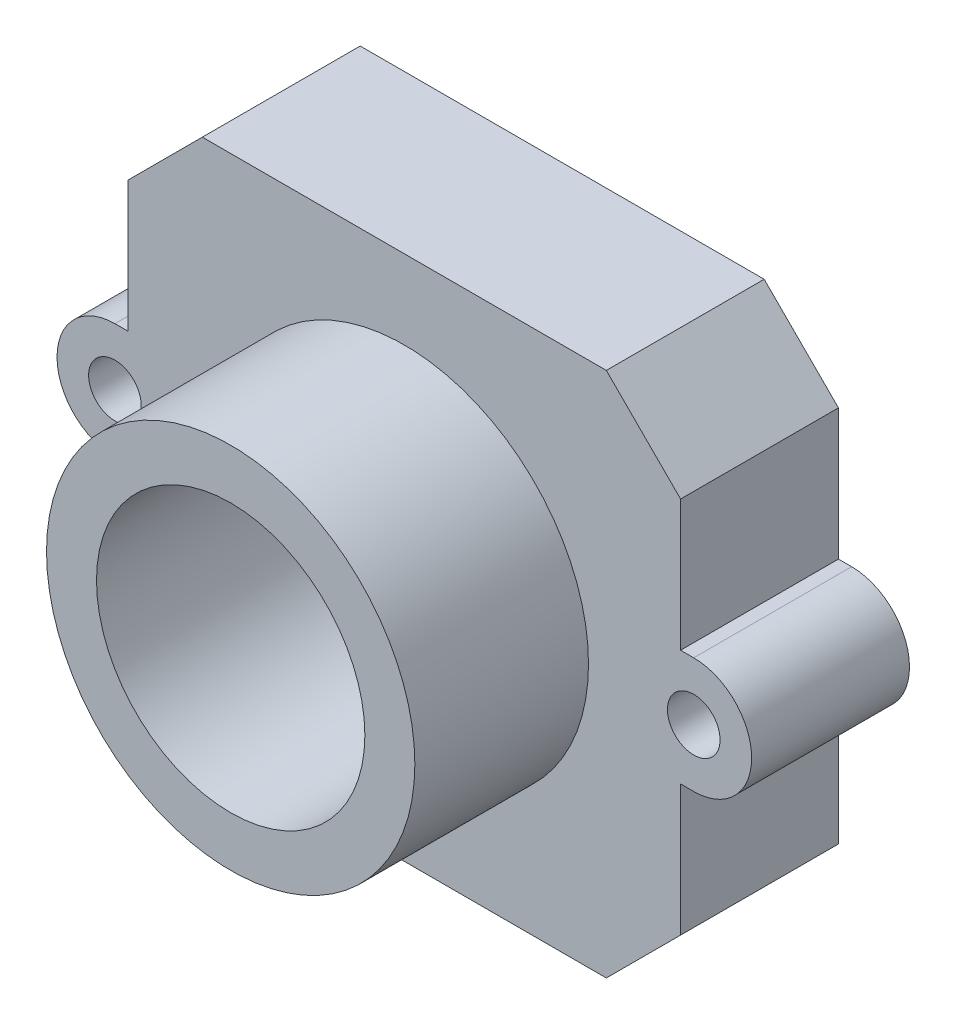
ISO-10303-21;
HEADER;
FILE_DESCRIPTION(('STEP AP214'),'2;1');
FILE_NAME('part.step','',(''),(''),'','','');
FILE_SCHEMA(('AUTOMOTIVE_DESIGN { 1 0 10303 214 1 1 1 1 }'));
ENDSEC;
DATA;
#1=APPLICATION_CONTEXT('core data for automotive mechanical design processes');
#2=APPLICATION_PROTOCOL_DEFINITION('international standard','automotive_design',2000,#1);
#3=PRODUCT_CONTEXT('',#1,'mechanical');
#4=PRODUCT('Part','Part','',(#3));
#5=PRODUCT_RELATED_PRODUCT_CATEGORY('part','',(#4));
#6=PRODUCT_DEFINITION_FORMATION('','',#4);
#7=PRODUCT_DEFINITION_CONTEXT('part definition',#1,'design');
#8=PRODUCT_DEFINITION('design','',#6,#7);
#9=PRODUCT_DEFINITION_SHAPE('','',#8);
#10=(LENGTH_UNIT() NAMED_UNIT(*) SI_UNIT(.MILLI.,.METRE.));
#11=(NAMED_UNIT(*) PLANE_ANGLE_UNIT() SI_UNIT($,.RADIAN.));
#12=(NAMED_UNIT(*) SI_UNIT($,.STERADIAN.) SOLID_ANGLE_UNIT());
#13=UNCERTAINTY_MEASURE_WITH_UNIT(LENGTH_MEASURE(1.E-05),#10,'distance_accuracy_value','');
#14=(GEOMETRIC_REPRESENTATION_CONTEXT(3) GLOBAL_UNCERTAINTY_ASSIGNED_CONTEXT((#13)) GLOBAL_UNIT_ASSIGNED_CONTEXT((#10,
#11,#12)) REPRESENTATION_CONTEXT('',''));
#15=CARTESIAN_POINT('',(0.,0.,0.));
#16=DIRECTION('',(0.,0.,1.));
#17=DIRECTION('',(1.,0.,0.));
#18=AXIS2_PLACEMENT_3D('',#15,#16,#17);
#19=CARTESIAN_POINT('',(0.,0.,1.));
#20=DIRECTION('',(0.,0.,1.));
#21=DIRECTION('',(1.,0.,0.));
#22=AXIS2_PLACEMENT_3D('',#19,#20,#21);
#23=PLANE('',#22);
#24=DIRECTION('',(1.,0.,0.));
#25=VECTOR('',#24,1.);
#26=CARTESIAN_POINT('',(0.,2.2,1.));
#27=LINE('',#26,#25);
#28=CARTESIAN_POINT('',(10.5,2.2,1.));
#29=VERTEX_POINT('',#28);
#30=CARTESIAN_POINT('',(11.,2.2,1.));
#31=VERTEX_POINT('',#30);
#32=EDGE_CURVE('E323',#29,#31,#27,.T.);
#33=ORIENTED_EDGE('',*,*,#32,.F.);
#34=DIRECTION('',(0.,-1.,0.));
#35=VECTOR('',#34,1.);
#36=CARTESIAN_POINT('',(10.5,0.,1.));
#37=LINE('',#36,#35);
#38=CARTESIAN_POINT('',(10.5,7.17766952966368,1.));
#39=VERTEX_POINT('',#38);
#40=EDGE_CURVE('E197',#39,#29,#37,.T.);
#41=ORIENTED_EDGE('',*,*,#40,.F.);
#42=DIRECTION('',(0.707106781186548,-0.707106781186547,0.));
#43=VECTOR('',#42,1.);
#44=CARTESIAN_POINT('',(8.83883476483184,8.83883476483185,1.));
#45=LINE('',#44,#43);
#46=CARTESIAN_POINT('',(7.67766952966368,10.,1.));
#47=VERTEX_POINT('',#46);
#48=EDGE_CURVE('E326',#47,#39,#45,.T.);
#49=ORIENTED_EDGE('',*,*,#48,.F.);
#50=DIRECTION('',(1.,0.,0.));
#51=VECTOR('',#50,1.);
#52=CARTESIAN_POINT('',(0.,10.,1.));
#53=LINE('',#52,#51);
#54=CARTESIAN_POINT('',(-7.67766952966369,9.99999999999999,1.));
#55=VERTEX_POINT('',#54);
#56=EDGE_CURVE('E330',#55,#47,#53,.T.);
#57=ORIENTED_EDGE('',*,*,#56,.F.);
#58=DIRECTION('',(0.707106781186548,0.707106781186547,0.));
#59=VECTOR('',#58,1.);
#60=CARTESIAN_POINT('',(-8.83883476483184,8.83883476483185,1.));
#61=LINE('',#60,#59);
#62=CARTESIAN_POINT('',(-10.5,7.17766952966369,1.));
#63=VERTEX_POINT('',#62);
#64=EDGE_CURVE('E333',#63,#55,#61,.T.);
#65=ORIENTED_EDGE('',*,*,#64,.F.);
#66=DIRECTION('',(0.,-1.,0.));
#67=VECTOR('',#66,1.);
#68=CARTESIAN_POINT('',(-10.5,0.,1.));
#69=LINE('',#68,#67);
#70=CARTESIAN_POINT('',(-10.5,2.2,1.));
#71=VERTEX_POINT('',#70);
#72=EDGE_CURVE('E336',#63,#71,#69,.T.);
#73=ORIENTED_EDGE('',*,*,#72,.T.);
#74=DIRECTION('',(-1.,0.,0.));
#75=VECTOR('',#74,1.);
#76=CARTESIAN_POINT('',(0.,2.2,1.));
#77=LINE('',#76,#75);
#78=CARTESIAN_POINT('',(-11.0000002241671,2.2,1.));
#79=VERTEX_POINT('',#78);
#80=EDGE_CURVE('E339',#71,#79,#77,.T.);
#81=ORIENTED_EDGE('',*,*,#80,.T.);
#82=CARTESIAN_POINT('',(-11.0000002241671,0.,1.));
#83=DIRECTION('',(0.,0.,1.));
#84=DIRECTION('',(1.,0.,0.));
#85=AXIS2_PLACEMENT_3D('',#82,#83,#84);
#86=CIRCLE('',#85,2.2);
#87=CARTESIAN_POINT('',(-11.0000002241671,-2.2,1.));
#88=VERTEX_POINT('',#87);
#89=EDGE_CURVE('E342',#88,#79,#86,.F.);
#90=ORIENTED_EDGE('',*,*,#89,.F.);
#91=DIRECTION('',(-1.,0.,0.));
#92=VECTOR('',#91,1.);
#93=CARTESIAN_POINT('',(0.,-2.2,1.));
#94=LINE('',#93,#92);
#95=CARTESIAN_POINT('',(-10.5,-2.2,1.));
#96=VERTEX_POINT('',#95);
#97=EDGE_CURVE('E345',#96,#88,#94,.T.);
#98=ORIENTED_EDGE('',*,*,#97,.F.);
#99=CARTESIAN_POINT('',(-10.5,-7.1776695296637,1.));
#100=VERTEX_POINT('',#99);
#101=EDGE_CURVE('E340',#96,#100,#69,.T.);
#102=ORIENTED_EDGE('',*,*,#101,.T.);
#103=DIRECTION('',(0.707106781186548,-0.707106781186547,0.));
#104=VECTOR('',#103,1.);
#105=CARTESIAN_POINT('',(-8.83883476483184,-8.83883476483185,1.));
#106=LINE('',#105,#104);
#107=CARTESIAN_POINT('',(-7.67766952966369,-10.,1.));
#108=VERTEX_POINT('',#107);
#109=EDGE_CURVE('E348',#100,#108,#106,.T.);
#110=ORIENTED_EDGE('',*,*,#109,.T.);
#111=DIRECTION('',(1.,0.,0.));
#112=VECTOR('',#111,1.);
#113=CARTESIAN_POINT('',(0.,-10.,1.));
#114=LINE('',#113,#112);
#115=CARTESIAN_POINT('',(7.67766952966369,-10.,1.));
#116=VERTEX_POINT('',#115);
#117=EDGE_CURVE('E351',#108,#116,#114,.T.);
#118=ORIENTED_EDGE('',*,*,#117,.T.);
#119=DIRECTION('',(0.707106781186548,0.707106781186547,0.));
#120=VECTOR('',#119,1.);
#121=CARTESIAN_POINT('',(8.83883476483185,-8.83883476483185,1.));
#122=LINE('',#121,#120);
#123=CARTESIAN_POINT('',(10.5,-7.17766952966369,1.));
#124=VERTEX_POINT('',#123);
#125=EDGE_CURVE('E354',#116,#124,#122,.T.);
#126=ORIENTED_EDGE('',*,*,#125,.T.);
#127=CARTESIAN_POINT('',(10.5,-2.2,1.));
#128=VERTEX_POINT('',#127);
#129=EDGE_CURVE('E327',#128,#124,#37,.T.);
#130=ORIENTED_EDGE('',*,*,#129,.F.);
#131=DIRECTION('',(1.,0.,0.));
#132=VECTOR('',#131,1.);
#133=CARTESIAN_POINT('',(0.,-2.2,1.));
#134=LINE('',#133,#132);
#135=CARTESIAN_POINT('',(11.,-2.2,1.));
#136=VERTEX_POINT('',#135);
#137=EDGE_CURVE('E356',#128,#136,#134,.T.);
#138=ORIENTED_EDGE('',*,*,#137,.T.);
#139=CARTESIAN_POINT('',(11.,0.,1.));
#140=DIRECTION('',(0.,0.,1.));
#141=DIRECTION('',(1.,0.,0.));
#142=AXIS2_PLACEMENT_3D('',#139,#140,#141);
#143=CIRCLE('',#142,2.2);
#144=EDGE_CURVE('E358',#31,#136,#143,.F.);
#145=ORIENTED_EDGE('',*,*,#144,.F.);
#146=EDGE_LOOP('',(#33,#41,#49,#57,#65,#73,#81,#90,#98,#102,#110,#118,#126,#130,#138,#145));
#147=FACE_BOUND('',#146,.T.);
#148=CARTESIAN_POINT('',(-11.0000002241671,0.,1.));
#149=DIRECTION('',(0.,0.,1.));
#150=DIRECTION('',(1.,0.,0.));
#151=AXIS2_PLACEMENT_3D('',#148,#149,#150);
#152=CIRCLE('',#151,1.);
#153=CARTESIAN_POINT('',(-10.0000002241671,0.,1.));
#154=VERTEX_POINT('',#153);
#155=EDGE_CURVE('E320',#154,#154,#152,.T.);
#156=ORIENTED_EDGE('',*,*,#155,.F.);
#157=EDGE_LOOP('',(#156));
#158=FACE_BOUND('',#157,.T.);
#159=CARTESIAN_POINT('',(11.,0.,1.));
#160=DIRECTION('',(0.,0.,1.));
#161=DIRECTION('',(1.,0.,0.));
#162=AXIS2_PLACEMENT_3D('',#159,#160,#161);
#163=CIRCLE('',#162,1.);
#164=CARTESIAN_POINT('',(12.,0.,1.));
#165=VERTEX_POINT('',#164);
#166=EDGE_CURVE('E297',#165,#165,#163,.T.);
#167=ORIENTED_EDGE('',*,*,#166,.F.);
#168=EDGE_LOOP('',(#167));
#169=FACE_BOUND('',#168,.T.);
#170=CARTESIAN_POINT('',(0.,0.,1.));
#171=DIRECTION('',(0.,0.,1.));
#172=DIRECTION('',(1.,0.,0.));
#173=AXIS2_PLACEMENT_3D('',#170,#171,#172);
#174=CIRCLE('',#173,7.);
#175=CARTESIAN_POINT('',(7.,0.,1.));
#176=VERTEX_POINT('',#175);
#177=EDGE_CURVE('E812',#176,#176,#174,.T.);
#178=ORIENTED_EDGE('',*,*,#177,.F.);
#179=EDGE_LOOP('',(#178));
#180=FACE_BOUND('',#179,.T.);
#181=ADVANCED_FACE('F34',(#147,#158,#169,#180),#23,.T.);
#182=CARTESIAN_POINT('',(0.,2.2,1.));
#183=DIRECTION('',(0.,1.,0.));
#184=DIRECTION('',(0.,0.,1.));
#185=AXIS2_PLACEMENT_3D('',#182,#183,#184);
#186=PLANE('',#185);
#187=DIRECTION('',(0.,0.,-1.));
#188=VECTOR('',#187,1.);
#189=CARTESIAN_POINT('',(11.,2.2,1.));
#190=LINE('',#189,#188);
#191=CARTESIAN_POINT('',(11.,2.2,-5.));
#192=VERTEX_POINT('',#191);
#193=EDGE_CURVE('E215',#31,#192,#190,.T.);
#194=ORIENTED_EDGE('',*,*,#193,.T.);
#195=DIRECTION('',(1.,0.,0.));
#196=VECTOR('',#195,1.);
#197=CARTESIAN_POINT('',(0.,2.2,-5.));
#198=LINE('',#197,#196);
#199=CARTESIAN_POINT('',(10.5,2.2,-5.));
#200=VERTEX_POINT('',#199);
#201=EDGE_CURVE('E208',#200,#192,#198,.T.);
#202=ORIENTED_EDGE('',*,*,#201,.F.);
#203=DIRECTION('',(0.,0.,-1.));
#204=VECTOR('',#203,1.);
#205=CARTESIAN_POINT('',(10.5,2.2,1.));
#206=LINE('',#205,#204);
#207=EDGE_CURVE('E11',#29,#200,#206,.T.);
#208=ORIENTED_EDGE('',*,*,#207,.F.);
#209=ORIENTED_EDGE('',*,*,#32,.T.);
#210=EDGE_LOOP('',(#194,#202,#208,#209));
#211=FACE_BOUND('',#210,.T.);
#212=ADVANCED_FACE('F214',(#211),#186,.T.);
#213=CARTESIAN_POINT('',(10.5,0.,1.));
#214=DIRECTION('',(1.,0.,0.));
#215=DIRECTION('',(0.,0.,-1.));
#216=AXIS2_PLACEMENT_3D('',#213,#214,#215);
#217=PLANE('',#216);
#218=ORIENTED_EDGE('',*,*,#207,.T.);
#219=DIRECTION('',(0.,-1.,0.));
#220=VECTOR('',#219,1.);
#221=CARTESIAN_POINT('',(10.5,0.,-5.));
#222=LINE('',#221,#220);
#223=CARTESIAN_POINT('',(10.5,7.17766952966368,-5.));
#224=VERTEX_POINT('',#223);
#225=EDGE_CURVE('E195',#224,#200,#222,.T.);
#226=ORIENTED_EDGE('',*,*,#225,.F.);
#227=DIRECTION('',(0.,0.,-1.));
#228=VECTOR('',#227,1.);
#229=CARTESIAN_POINT('',(10.5,7.17766952966368,1.));
#230=LINE('',#229,#228);
#231=EDGE_CURVE('E43',#39,#224,#230,.T.);
#232=ORIENTED_EDGE('',*,*,#231,.F.);
#233=ORIENTED_EDGE('',*,*,#40,.T.);
#234=EDGE_LOOP('',(#218,#226,#232,#233));
#235=FACE_BOUND('',#234,.T.);
#236=ADVANCED_FACE('F194',(#235),#217,.T.);
#237=CARTESIAN_POINT('',(8.83883476483184,8.83883476483185,1.));
#238=DIRECTION('',(0.707106781186547,0.707106781186548,0.));
#239=DIRECTION('',(-0.707106781186548,0.707106781186547,0.));
#240=AXIS2_PLACEMENT_3D('',#237,#238,#239);
#241=PLANE('',#240);
#242=ORIENTED_EDGE('',*,*,#231,.T.);
#243=DIRECTION('',(0.707106781186548,-0.707106781186547,0.));
#244=VECTOR('',#243,1.);
#245=CARTESIAN_POINT('',(8.83883476483184,8.83883476483185,-5.));
#246=LINE('',#245,#244);
#247=CARTESIAN_POINT('',(7.67766952966368,10.,-5.));
#248=VERTEX_POINT('',#247);
#249=EDGE_CURVE('E211',#248,#224,#246,.T.);
#250=ORIENTED_EDGE('',*,*,#249,.F.);
#251=DIRECTION('',(0.,0.,-1.));
#252=VECTOR('',#251,1.);
#253=CARTESIAN_POINT('',(7.67766952966368,10.,1.));
#254=LINE('',#253,#252);
#255=EDGE_CURVE('E386',#47,#248,#254,.T.);
#256=ORIENTED_EDGE('',*,*,#255,.F.);
#257=ORIENTED_EDGE('',*,*,#48,.T.);
#258=EDGE_LOOP('',(#242,#250,#256,#257));
#259=FACE_BOUND('',#258,.T.);
#260=ADVANCED_FACE('F389',(#259),#241,.T.);
#261=CARTESIAN_POINT('',(0.,10.,1.));
#262=DIRECTION('',(0.,1.,0.));
#263=DIRECTION('',(0.,0.,1.));
#264=AXIS2_PLACEMENT_3D('',#261,#262,#263);
#265=PLANE('',#264);
#266=ORIENTED_EDGE('',*,*,#255,.T.);
#267=DIRECTION('',(1.,0.,0.));
#268=VECTOR('',#267,1.);
#269=CARTESIAN_POINT('',(0.,10.,-5.));
#270=LINE('',#269,#268);
#271=CARTESIAN_POINT('',(-7.67766952966369,9.99999999999999,-5.));
#272=VERTEX_POINT('',#271);
#273=EDGE_CURVE('E225',#272,#248,#270,.T.);
#274=ORIENTED_EDGE('',*,*,#273,.F.);
#275=DIRECTION('',(0.,0.,-1.));
#276=VECTOR('',#275,1.);
#277=CARTESIAN_POINT('',(-7.67766952966369,9.99999999999999,1.));
#278=LINE('',#277,#276);
#279=EDGE_CURVE('E384',#55,#272,#278,.T.);
#280=ORIENTED_EDGE('',*,*,#279,.F.);
#281=ORIENTED_EDGE('',*,*,#56,.T.);
#282=EDGE_LOOP('',(#266,#274,#280,#281));
#283=FACE_BOUND('',#282,.T.);
#284=ADVANCED_FACE('F449',(#283),#265,.T.);
#285=CARTESIAN_POINT('',(-8.83883476483184,8.83883476483185,1.));
#286=DIRECTION('',(-0.707106781186547,0.707106781186548,0.));
#287=DIRECTION('',(-0.707106781186548,-0.707106781186547,0.));
#288=AXIS2_PLACEMENT_3D('',#285,#286,#287);
#289=PLANE('',#288);
#290=ORIENTED_EDGE('',*,*,#279,.T.);
#291=DIRECTION('',(0.707106781186548,0.707106781186547,0.));
#292=VECTOR('',#291,1.);
#293=CARTESIAN_POINT('',(-8.83883476483184,8.83883476483185,-5.));
#294=LINE('',#293,#292);
#295=CARTESIAN_POINT('',(-10.5,7.17766952966369,-5.));
#296=VERTEX_POINT('',#295);
#297=EDGE_CURVE('E227',#296,#272,#294,.T.);
#298=ORIENTED_EDGE('',*,*,#297,.F.);
#299=DIRECTION('',(0.,0.,-1.));
#300=VECTOR('',#299,1.);
#301=CARTESIAN_POINT('',(-10.5,7.17766952966369,1.));
#302=LINE('',#301,#300);
#303=EDGE_CURVE('E382',#63,#296,#302,.T.);
#304=ORIENTED_EDGE('',*,*,#303,.F.);
#305=ORIENTED_EDGE('',*,*,#64,.T.);
#306=EDGE_LOOP('',(#290,#298,#304,#305));
#307=FACE_BOUND('',#306,.T.);
#308=ADVANCED_FACE('F446',(#307),#289,.T.);
#309=CARTESIAN_POINT('',(-10.5,0.,1.));
#310=DIRECTION('',(1.,0.,0.));
#311=DIRECTION('',(0.,0.,-1.));
#312=AXIS2_PLACEMENT_3D('',#309,#310,#311);
#313=PLANE('',#312);
#314=ORIENTED_EDGE('',*,*,#303,.T.);
#315=DIRECTION('',(0.,-1.,0.));
#316=VECTOR('',#315,1.);
#317=CARTESIAN_POINT('',(-10.5,0.,-5.));
#318=LINE('',#317,#316);
#319=CARTESIAN_POINT('',(-10.5,2.2,-5.));
#320=VERTEX_POINT('',#319);
#321=EDGE_CURVE('E230',#296,#320,#318,.T.);
#322=ORIENTED_EDGE('',*,*,#321,.T.);
#323=DIRECTION('',(0.,0.,-1.));
#324=VECTOR('',#323,1.);
#325=CARTESIAN_POINT('',(-10.5,2.2,1.));
#326=LINE('',#325,#324);
#327=EDGE_CURVE('E380',#71,#320,#326,.T.);
#328=ORIENTED_EDGE('',*,*,#327,.F.);
#329=ORIENTED_EDGE('',*,*,#72,.F.);
#330=EDGE_LOOP('',(#314,#322,#328,#329));
#331=FACE_BOUND('',#330,.T.);
#332=ADVANCED_FACE('F441',(#331),#313,.F.);
#333=CARTESIAN_POINT('',(0.,2.2,1.));
#334=DIRECTION('',(0.,-1.,0.));
#335=DIRECTION('',(0.,0.,-1.));
#336=AXIS2_PLACEMENT_3D('',#333,#334,#335);
#337=PLANE('',#336);
#338=ORIENTED_EDGE('',*,*,#327,.T.);
#339=DIRECTION('',(-1.,0.,0.));
#340=VECTOR('',#339,1.);
#341=CARTESIAN_POINT('',(0.,2.2,-5.));
#342=LINE('',#341,#340);
#343=CARTESIAN_POINT('',(-11.0000002241671,2.2,-5.));
#344=VERTEX_POINT('',#343);
#345=EDGE_CURVE('E233',#320,#344,#342,.T.);
#346=ORIENTED_EDGE('',*,*,#345,.T.);
#347=DIRECTION('',(0.,0.,-1.));
#348=VECTOR('',#347,1.);
#349=CARTESIAN_POINT('',(-11.0000002241671,2.2,1.));
#350=LINE('',#349,#348);
#351=EDGE_CURVE('E378',#79,#344,#350,.T.);
#352=ORIENTED_EDGE('',*,*,#351,.F.);
#353=ORIENTED_EDGE('',*,*,#80,.F.);
#354=EDGE_LOOP('',(#338,#346,#352,#353));
#355=FACE_BOUND('',#354,.T.);
#356=ADVANCED_FACE('F437',(#355),#337,.F.);
#357=CARTESIAN_POINT('',(-11.0000002241671,0.,1.));
#358=DIRECTION('',(0.,0.,-1.));
#359=DIRECTION('',(-1.,0.,0.));
#360=AXIS2_PLACEMENT_3D('',#357,#358,#359);
#361=CYLINDRICAL_SURFACE('',#360,2.2);
#362=ORIENTED_EDGE('',*,*,#351,.T.);
#363=CARTESIAN_POINT('',(-11.0000002241671,0.,-5.));
#364=DIRECTION('',(0.,0.,1.));
#365=DIRECTION('',(1.,0.,0.));
#366=AXIS2_PLACEMENT_3D('',#363,#364,#365);
#367=CIRCLE('',#366,2.2);
#368=CARTESIAN_POINT('',(-11.0000002241671,-2.2,-5.));
#369=VERTEX_POINT('',#368);
#370=EDGE_CURVE('E237',#369,#344,#367,.F.);
#371=ORIENTED_EDGE('',*,*,#370,.F.);
#372=DIRECTION('',(0.,0.,-1.));
#373=VECTOR('',#372,1.);
#374=CARTESIAN_POINT('',(-11.0000002241671,-2.2,1.));
#375=LINE('',#374,#373);
#376=EDGE_CURVE('E376',#88,#369,#375,.T.);
#377=ORIENTED_EDGE('',*,*,#376,.F.);
#378=ORIENTED_EDGE('',*,*,#89,.T.);
#379=EDGE_LOOP('',(#362,#371,#377,#378));
#380=FACE_BOUND('',#379,.T.);
#381=ADVANCED_FACE('F433',(#380),#361,.T.);
#382=CARTESIAN_POINT('',(0.,-2.2,1.));
#383=DIRECTION('',(0.,-1.,0.));
#384=DIRECTION('',(0.,0.,-1.));
#385=AXIS2_PLACEMENT_3D('',#382,#383,#384);
#386=PLANE('',#385);
#387=ORIENTED_EDGE('',*,*,#376,.T.);
#388=DIRECTION('',(-1.,0.,0.));
#389=VECTOR('',#388,1.);
#390=CARTESIAN_POINT('',(0.,-2.2,-5.));
#391=LINE('',#390,#389);
#392=CARTESIAN_POINT('',(-10.5,-2.2,-5.));
#393=VERTEX_POINT('',#392);
#394=EDGE_CURVE('E240',#393,#369,#391,.T.);
#395=ORIENTED_EDGE('',*,*,#394,.F.);
#396=DIRECTION('',(0.,0.,-1.));
#397=VECTOR('',#396,1.);
#398=CARTESIAN_POINT('',(-10.5,-2.2,1.));
#399=LINE('',#398,#397);
#400=EDGE_CURVE('E374',#96,#393,#399,.T.);
#401=ORIENTED_EDGE('',*,*,#400,.F.);
#402=ORIENTED_EDGE('',*,*,#97,.T.);
#403=EDGE_LOOP('',(#387,#395,#401,#402));
#404=FACE_BOUND('',#403,.T.);
#405=ADVANCED_FACE('F450',(#404),#386,.T.);
#406=ORIENTED_EDGE('',*,*,#400,.T.);
#407=CARTESIAN_POINT('',(-10.5,-7.1776695296637,-5.));
#408=VERTEX_POINT('',#407);
#409=EDGE_CURVE('E234',#393,#408,#318,.T.);
#410=ORIENTED_EDGE('',*,*,#409,.T.);
#411=DIRECTION('',(0.,0.,-1.));
#412=VECTOR('',#411,1.);
#413=CARTESIAN_POINT('',(-10.5,-7.1776695296637,1.));
#414=LINE('',#413,#412);
#415=EDGE_CURVE('E372',#100,#408,#414,.T.);
#416=ORIENTED_EDGE('',*,*,#415,.F.);
#417=ORIENTED_EDGE('',*,*,#101,.F.);
#418=EDGE_LOOP('',(#406,#410,#416,#417));
#419=FACE_BOUND('',#418,.T.);
#420=ADVANCED_FACE('F426',(#419),#313,.F.);
#421=CARTESIAN_POINT('',(-8.83883476483184,-8.83883476483185,1.));
#422=DIRECTION('',(0.707106781186547,0.707106781186548,0.));
#423=DIRECTION('',(-0.707106781186548,0.707106781186547,0.));
#424=AXIS2_PLACEMENT_3D('',#421,#422,#423);
#425=PLANE('',#424);
#426=ORIENTED_EDGE('',*,*,#415,.T.);
#427=DIRECTION('',(0.707106781186548,-0.707106781186547,0.));
#428=VECTOR('',#427,1.);
#429=CARTESIAN_POINT('',(-8.83883476483184,-8.83883476483185,-5.));
#430=LINE('',#429,#428);
#431=CARTESIAN_POINT('',(-7.67766952966369,-10.,-5.));
#432=VERTEX_POINT('',#431);
#433=EDGE_CURVE('E243',#408,#432,#430,.T.);
#434=ORIENTED_EDGE('',*,*,#433,.T.);
#435=DIRECTION('',(0.,0.,-1.));
#436=VECTOR('',#435,1.);
#437=CARTESIAN_POINT('',(-7.67766952966369,-10.,1.));
#438=LINE('',#437,#436);
#439=EDGE_CURVE('E370',#108,#432,#438,.T.);
#440=ORIENTED_EDGE('',*,*,#439,.F.);
#441=ORIENTED_EDGE('',*,*,#109,.F.);
#442=EDGE_LOOP('',(#426,#434,#440,#441));
#443=FACE_BOUND('',#442,.T.);
#444=ADVANCED_FACE('F421',(#443),#425,.F.);
#445=CARTESIAN_POINT('',(0.,-10.,1.));
#446=DIRECTION('',(0.,1.,0.));
#447=DIRECTION('',(0.,0.,1.));
#448=AXIS2_PLACEMENT_3D('',#445,#446,#447);
#449=PLANE('',#448);
#450=ORIENTED_EDGE('',*,*,#439,.T.);
#451=DIRECTION('',(1.,0.,0.));
#452=VECTOR('',#451,1.);
#453=CARTESIAN_POINT('',(0.,-10.,-5.));
#454=LINE('',#453,#452);
#455=CARTESIAN_POINT('',(7.67766952966369,-10.,-5.));
#456=VERTEX_POINT('',#455);
#457=EDGE_CURVE('E246',#432,#456,#454,.T.);
#458=ORIENTED_EDGE('',*,*,#457,.T.);
#459=DIRECTION('',(0.,0.,-1.));
#460=VECTOR('',#459,1.);
#461=CARTESIAN_POINT('',(7.67766952966369,-10.,1.));
#462=LINE('',#461,#460);
#463=EDGE_CURVE('E368',#116,#456,#462,.T.);
#464=ORIENTED_EDGE('',*,*,#463,.F.);
#465=ORIENTED_EDGE('',*,*,#117,.F.);
#466=EDGE_LOOP('',(#450,#458,#464,#465));
#467=FACE_BOUND('',#466,.T.);
#468=ADVANCED_FACE('F415',(#467),#449,.F.);
#469=CARTESIAN_POINT('',(8.83883476483185,-8.83883476483185,1.));
#470=DIRECTION('',(-0.707106781186547,0.707106781186548,0.));
#471=DIRECTION('',(-0.707106781186548,-0.707106781186547,0.));
#472=AXIS2_PLACEMENT_3D('',#469,#470,#471);
#473=PLANE('',#472);
#474=ORIENTED_EDGE('',*,*,#463,.T.);
#475=DIRECTION('',(0.707106781186548,0.707106781186547,0.));
#476=VECTOR('',#475,1.);
#477=CARTESIAN_POINT('',(8.83883476483185,-8.83883476483185,-5.));
#478=LINE('',#477,#476);
#479=CARTESIAN_POINT('',(10.5,-7.17766952966369,-5.));
#480=VERTEX_POINT('',#479);
#481=EDGE_CURVE('E249',#456,#480,#478,.T.);
#482=ORIENTED_EDGE('',*,*,#481,.T.);
#483=DIRECTION('',(0.,0.,-1.));
#484=VECTOR('',#483,1.);
#485=CARTESIAN_POINT('',(10.5,-7.17766952966369,1.));
#486=LINE('',#485,#484);
#487=EDGE_CURVE('E366',#124,#480,#486,.T.);
#488=ORIENTED_EDGE('',*,*,#487,.F.);
#489=ORIENTED_EDGE('',*,*,#125,.F.);
#490=EDGE_LOOP('',(#474,#482,#488,#489));
#491=FACE_BOUND('',#490,.T.);
#492=ADVANCED_FACE('F412',(#491),#473,.F.);
#493=ORIENTED_EDGE('',*,*,#487,.T.);
#494=CARTESIAN_POINT('',(10.5,-2.2,-5.));
#495=VERTEX_POINT('',#494);
#496=EDGE_CURVE('E213',#495,#480,#222,.T.);
#497=ORIENTED_EDGE('',*,*,#496,.F.);
#498=DIRECTION('',(0.,0.,-1.));
#499=VECTOR('',#498,1.);
#500=CARTESIAN_POINT('',(10.5,-2.2,1.));
#501=LINE('',#500,#499);
#502=EDGE_CURVE('E364',#128,#495,#501,.T.);
#503=ORIENTED_EDGE('',*,*,#502,.F.);
#504=ORIENTED_EDGE('',*,*,#129,.T.);
#505=EDGE_LOOP('',(#493,#497,#503,#504));
#506=FACE_BOUND('',#505,.T.);
#507=ADVANCED_FACE('F407',(#506),#217,.T.);
#508=CARTESIAN_POINT('',(0.,-2.2,1.));
#509=DIRECTION('',(0.,1.,0.));
#510=DIRECTION('',(0.,0.,1.));
#511=AXIS2_PLACEMENT_3D('',#508,#509,#510);
#512=PLANE('',#511);
#513=ORIENTED_EDGE('',*,*,#502,.T.);
#514=DIRECTION('',(1.,0.,0.));
#515=VECTOR('',#514,1.);
#516=CARTESIAN_POINT('',(0.,-2.2,-5.));
#517=LINE('',#516,#515);
#518=CARTESIAN_POINT('',(11.,-2.2,-5.));
#519=VERTEX_POINT('',#518);
#520=EDGE_CURVE('E252',#495,#519,#517,.T.);
#521=ORIENTED_EDGE('',*,*,#520,.T.);
#522=DIRECTION('',(0.,0.,-1.));
#523=VECTOR('',#522,1.);
#524=CARTESIAN_POINT('',(11.,-2.2,1.));
#525=LINE('',#524,#523);
#526=EDGE_CURVE('E362',#136,#519,#525,.T.);
#527=ORIENTED_EDGE('',*,*,#526,.F.);
#528=ORIENTED_EDGE('',*,*,#137,.F.);
#529=EDGE_LOOP('',(#513,#521,#527,#528));
#530=FACE_BOUND('',#529,.T.);
#531=ADVANCED_FACE('F403',(#530),#512,.F.);
#532=CARTESIAN_POINT('',(-11.0000002241671,0.,1.));
#533=DIRECTION('',(0.,0.,-1.));
#534=DIRECTION('',(-1.,0.,0.));
#535=AXIS2_PLACEMENT_3D('',#532,#533,#534);
#536=CYLINDRICAL_SURFACE('',#535,1.);
#537=ORIENTED_EDGE('',*,*,#155,.T.);
#538=EDGE_LOOP('',(#537));
#539=FACE_BOUND('',#538,.T.);
#540=CARTESIAN_POINT('',(-11.0000002241671,0.,-5.));
#541=DIRECTION('',(0.,0.,1.));
#542=DIRECTION('',(1.,0.,0.));
#543=AXIS2_PLACEMENT_3D('',#540,#541,#542);
#544=CIRCLE('',#543,1.);
#545=CARTESIAN_POINT('',(-10.0000002241671,0.,-5.));
#546=VERTEX_POINT('',#545);
#547=EDGE_CURVE('E217',#546,#546,#544,.T.);
#548=ORIENTED_EDGE('',*,*,#547,.F.);
#549=EDGE_LOOP('',(#548));
#550=FACE_BOUND('',#549,.T.);
#551=ADVANCED_FACE('F478',(#539,#550),#536,.F.);
#552=CARTESIAN_POINT('',(11.,0.,1.));
#553=DIRECTION('',(0.,0.,-1.));
#554=DIRECTION('',(-1.,0.,0.));
#555=AXIS2_PLACEMENT_3D('',#552,#553,#554);
#556=CYLINDRICAL_SURFACE('',#555,1.);
#557=ORIENTED_EDGE('',*,*,#166,.T.);
#558=EDGE_LOOP('',(#557));
#559=FACE_BOUND('',#558,.T.);
#560=CARTESIAN_POINT('',(11.,0.,-5.));
#561=DIRECTION('',(0.,0.,1.));
#562=DIRECTION('',(1.,0.,0.));
#563=AXIS2_PLACEMENT_3D('',#560,#561,#562);
#564=CIRCLE('',#563,1.);
#565=CARTESIAN_POINT('',(12.,0.,-5.));
#566=VERTEX_POINT('',#565);
#567=EDGE_CURVE('E220',#566,#566,#564,.T.);
#568=ORIENTED_EDGE('',*,*,#567,.F.);
#569=EDGE_LOOP('',(#568));
#570=FACE_BOUND('',#569,.T.);
#571=ADVANCED_FACE('F36',(#559,#570),#556,.F.);
#572=CARTESIAN_POINT('',(11.,0.,1.));
#573=DIRECTION('',(0.,0.,-1.));
#574=DIRECTION('',(-1.,0.,0.));
#575=AXIS2_PLACEMENT_3D('',#572,#573,#574);
#576=CYLINDRICAL_SURFACE('',#575,2.2);
#577=ORIENTED_EDGE('',*,*,#526,.T.);
#578=CARTESIAN_POINT('',(11.,0.,-5.));
#579=DIRECTION('',(0.,0.,1.));
#580=DIRECTION('',(1.,0.,0.));
#581=AXIS2_PLACEMENT_3D('',#578,#579,#580);
#582=CIRCLE('',#581,2.2);
#583=EDGE_CURVE('E255',#192,#519,#582,.F.);
#584=ORIENTED_EDGE('',*,*,#583,.F.);
#585=ORIENTED_EDGE('',*,*,#193,.F.);
#586=ORIENTED_EDGE('',*,*,#144,.T.);
#587=EDGE_LOOP('',(#577,#584,#585,#586));
#588=FACE_BOUND('',#587,.T.);
#589=ADVANCED_FACE('F399',(#588),#576,.T.);
#590=CARTESIAN_POINT('',(-7.77817459305203,7.77817459305202,-5.));
#591=DIRECTION('',(-0.707106781186548,0.707106781186547,0.));
#592=DIRECTION('',(-0.707106781186547,-0.707106781186548,0.));
#593=AXIS2_PLACEMENT_3D('',#590,#591,#592);
#594=PLANE('',#593);
#595=DIRECTION('',(-0.707106781186547,-0.707106781186548,0.));
#596=VECTOR('',#595,1.);
#597=CARTESIAN_POINT('',(-7.77817459305203,7.77817459305202,0.));
#598=LINE('',#597,#596);
#599=CARTESIAN_POINT('',(-7.05634918610405,8.5,0.));
#600=VERTEX_POINT('',#599);
#601=CARTESIAN_POINT('',(-9.,6.55634918610404,0.));
#602=VERTEX_POINT('',#601);
#603=EDGE_CURVE('E275',#600,#602,#598,.T.);
#604=ORIENTED_EDGE('',*,*,#603,.T.);
#605=DIRECTION('',(0.,0.,1.));
#606=VECTOR('',#605,1.);
#607=CARTESIAN_POINT('',(-9.,6.55634918610404,-5.));
#608=LINE('',#607,#606);
#609=CARTESIAN_POINT('',(-9.,6.55634918610404,-5.));
#610=VERTEX_POINT('',#609);
#611=EDGE_CURVE('E295',#610,#602,#608,.T.);
#612=ORIENTED_EDGE('',*,*,#611,.F.);
#613=DIRECTION('',(-0.707106781186547,-0.707106781186548,0.));
#614=VECTOR('',#613,1.);
#615=CARTESIAN_POINT('',(-7.77817459305203,7.77817459305202,-5.));
#616=LINE('',#615,#614);
#617=CARTESIAN_POINT('',(-7.05634918610405,8.5,-5.));
#618=VERTEX_POINT('',#617);
#619=EDGE_CURVE('E257',#618,#610,#616,.T.);
#620=ORIENTED_EDGE('',*,*,#619,.F.);
#621=DIRECTION('',(0.,0.,1.));
#622=VECTOR('',#621,1.);
#623=CARTESIAN_POINT('',(-7.05634918610405,8.5,-5.));
#624=LINE('',#623,#622);
#625=EDGE_CURVE('E274',#618,#600,#624,.T.);
#626=ORIENTED_EDGE('',*,*,#625,.T.);
#627=EDGE_LOOP('',(#604,#612,#620,#626));
#628=FACE_BOUND('',#627,.T.);
#629=ADVANCED_FACE('F467',(#628),#594,.F.);
#630=CARTESIAN_POINT('',(-9.,0.,-5.));
#631=DIRECTION('',(-1.,0.,0.));
#632=DIRECTION('',(0.,-1.,0.));
#633=AXIS2_PLACEMENT_3D('',#630,#631,#632);
#634=PLANE('',#633);
#635=DIRECTION('',(0.,-1.,0.));
#636=VECTOR('',#635,1.);
#637=CARTESIAN_POINT('',(-9.,0.,0.));
#638=LINE('',#637,#636);
#639=CARTESIAN_POINT('',(-9.,-6.55634918610405,0.));
#640=VERTEX_POINT('',#639);
#641=EDGE_CURVE('E50',#602,#640,#638,.T.);
#642=ORIENTED_EDGE('',*,*,#641,.T.);
#643=DIRECTION('',(0.,0.,1.));
#644=VECTOR('',#643,1.);
#645=CARTESIAN_POINT('',(-9.,-6.55634918610405,-5.));
#646=LINE('',#645,#644);
#647=CARTESIAN_POINT('',(-9.,-6.55634918610405,-5.));
#648=VERTEX_POINT('',#647);
#649=EDGE_CURVE('E298',#648,#640,#646,.T.);
#650=ORIENTED_EDGE('',*,*,#649,.F.);
#651=DIRECTION('',(0.,-1.,0.));
#652=VECTOR('',#651,1.);
#653=CARTESIAN_POINT('',(-9.,0.,-5.));
#654=LINE('',#653,#652);
#655=EDGE_CURVE('E272',#610,#648,#654,.T.);
#656=ORIENTED_EDGE('',*,*,#655,.F.);
#657=ORIENTED_EDGE('',*,*,#611,.T.);
#658=EDGE_LOOP('',(#642,#650,#656,#657));
#659=FACE_BOUND('',#658,.T.);
#660=ADVANCED_FACE('F528',(#659),#634,.F.);
#661=CARTESIAN_POINT('',(-7.77817459305203,-7.77817459305203,-5.));
#662=DIRECTION('',(-0.707106781186548,-0.707106781186548,0.));
#663=DIRECTION('',(0.707106781186548,-0.707106781186548,0.));
#664=AXIS2_PLACEMENT_3D('',#661,#662,#663);
#665=PLANE('',#664);
#666=DIRECTION('',(0.707106781186548,-0.707106781186548,0.));
#667=VECTOR('',#666,1.);
#668=CARTESIAN_POINT('',(-7.77817459305203,-7.77817459305203,0.));
#669=LINE('',#668,#667);
#670=CARTESIAN_POINT('',(-7.05634918610405,-8.5,0.));
#671=VERTEX_POINT('',#670);
#672=EDGE_CURVE('E55',#640,#671,#669,.T.);
#673=ORIENTED_EDGE('',*,*,#672,.T.);
#674=DIRECTION('',(0.,0.,1.));
#675=VECTOR('',#674,1.);
#676=CARTESIAN_POINT('',(-7.05634918610405,-8.5,-5.));
#677=LINE('',#676,#675);
#678=CARTESIAN_POINT('',(-7.05634918610405,-8.5,-5.));
#679=VERTEX_POINT('',#678);
#680=EDGE_CURVE('E301',#679,#671,#677,.T.);
#681=ORIENTED_EDGE('',*,*,#680,.F.);
#682=DIRECTION('',(0.707106781186548,-0.707106781186548,0.));
#683=VECTOR('',#682,1.);
#684=CARTESIAN_POINT('',(-7.77817459305203,-7.77817459305203,-5.));
#685=LINE('',#684,#683);
#686=EDGE_CURVE('E270',#648,#679,#685,.T.);
#687=ORIENTED_EDGE('',*,*,#686,.F.);
#688=ORIENTED_EDGE('',*,*,#649,.T.);
#689=EDGE_LOOP('',(#673,#681,#687,#688));
#690=FACE_BOUND('',#689,.T.);
#691=ADVANCED_FACE('F535',(#690),#665,.F.);
#692=CARTESIAN_POINT('',(0.,-8.5,-5.));
#693=DIRECTION('',(0.,-1.,0.));
#694=DIRECTION('',(0.,0.,-1.));
#695=AXIS2_PLACEMENT_3D('',#692,#693,#694);
#696=PLANE('',#695);
#697=DIRECTION('',(1.,0.,0.));
#698=VECTOR('',#697,1.);
#699=CARTESIAN_POINT('',(0.,-8.5,0.));
#700=LINE('',#699,#698);
#701=CARTESIAN_POINT('',(7.05634918610405,-8.5,0.));
#702=VERTEX_POINT('',#701);
#703=EDGE_CURVE('E290',#671,#702,#700,.T.);
#704=ORIENTED_EDGE('',*,*,#703,.T.);
#705=DIRECTION('',(0.,0.,1.));
#706=VECTOR('',#705,1.);
#707=CARTESIAN_POINT('',(7.05634918610405,-8.5,-5.));
#708=LINE('',#707,#706);
#709=CARTESIAN_POINT('',(7.05634918610405,-8.5,-5.));
#710=VERTEX_POINT('',#709);
#711=EDGE_CURVE('E304',#710,#702,#708,.T.);
#712=ORIENTED_EDGE('',*,*,#711,.F.);
#713=DIRECTION('',(1.,0.,0.));
#714=VECTOR('',#713,1.);
#715=CARTESIAN_POINT('',(0.,-8.5,-5.));
#716=LINE('',#715,#714);
#717=EDGE_CURVE('E268',#679,#710,#716,.T.);
#718=ORIENTED_EDGE('',*,*,#717,.F.);
#719=ORIENTED_EDGE('',*,*,#680,.T.);
#720=EDGE_LOOP('',(#704,#712,#718,#719));
#721=FACE_BOUND('',#720,.T.);
#722=ADVANCED_FACE('F543',(#721),#696,.F.);
#723=CARTESIAN_POINT('',(7.77817459305203,-7.77817459305203,-5.));
#724=DIRECTION('',(0.707106781186548,-0.707106781186548,0.));
#725=DIRECTION('',(0.707106781186548,0.707106781186548,0.));
#726=AXIS2_PLACEMENT_3D('',#723,#724,#725);
#727=PLANE('',#726);
#728=DIRECTION('',(0.707106781186548,0.707106781186548,0.));
#729=VECTOR('',#728,1.);
#730=CARTESIAN_POINT('',(7.77817459305203,-7.77817459305203,0.));
#731=LINE('',#730,#729);
#732=CARTESIAN_POINT('',(9.,-6.55634918610405,0.));
#733=VERTEX_POINT('',#732);
#734=EDGE_CURVE('E287',#702,#733,#731,.T.);
#735=ORIENTED_EDGE('',*,*,#734,.T.);
#736=DIRECTION('',(0.,0.,1.));
#737=VECTOR('',#736,1.);
#738=CARTESIAN_POINT('',(9.,-6.55634918610405,-5.));
#739=LINE('',#738,#737);
#740=CARTESIAN_POINT('',(9.,-6.55634918610405,-5.));
#741=VERTEX_POINT('',#740);
#742=EDGE_CURVE('E307',#741,#733,#739,.T.);
#743=ORIENTED_EDGE('',*,*,#742,.F.);
#744=DIRECTION('',(0.707106781186548,0.707106781186548,0.));
#745=VECTOR('',#744,1.);
#746=CARTESIAN_POINT('',(7.77817459305203,-7.77817459305203,-5.));
#747=LINE('',#746,#745);
#748=EDGE_CURVE('E266',#710,#741,#747,.T.);
#749=ORIENTED_EDGE('',*,*,#748,.F.);
#750=ORIENTED_EDGE('',*,*,#711,.T.);
#751=EDGE_LOOP('',(#735,#743,#749,#750));
#752=FACE_BOUND('',#751,.T.);
#753=ADVANCED_FACE('F551',(#752),#727,.F.);
#754=CARTESIAN_POINT('',(9.,0.,-5.));
#755=DIRECTION('',(1.,0.,0.));
#756=DIRECTION('',(0.,0.,-1.));
#757=AXIS2_PLACEMENT_3D('',#754,#755,#756);
#758=PLANE('',#757);
#759=DIRECTION('',(0.,1.,0.));
#760=VECTOR('',#759,1.);
#761=CARTESIAN_POINT('',(9.,0.,0.));
#762=LINE('',#761,#760);
#763=CARTESIAN_POINT('',(9.,6.55634918610405,0.));
#764=VERTEX_POINT('',#763);
#765=EDGE_CURVE('E284',#733,#764,#762,.T.);
#766=ORIENTED_EDGE('',*,*,#765,.T.);
#767=DIRECTION('',(0.,0.,1.));
#768=VECTOR('',#767,1.);
#769=CARTESIAN_POINT('',(9.,6.55634918610405,-5.));
#770=LINE('',#769,#768);
#771=CARTESIAN_POINT('',(9.,6.55634918610405,-5.));
#772=VERTEX_POINT('',#771);
#773=EDGE_CURVE('E310',#772,#764,#770,.T.);
#774=ORIENTED_EDGE('',*,*,#773,.F.);
#775=DIRECTION('',(0.,1.,0.));
#776=VECTOR('',#775,1.);
#777=CARTESIAN_POINT('',(9.,0.,-5.));
#778=LINE('',#777,#776);
#779=EDGE_CURVE('E264',#741,#772,#778,.T.);
#780=ORIENTED_EDGE('',*,*,#779,.F.);
#781=ORIENTED_EDGE('',*,*,#742,.T.);
#782=EDGE_LOOP('',(#766,#774,#780,#781));
#783=FACE_BOUND('',#782,.T.);
#784=ADVANCED_FACE('F559',(#783),#758,.F.);
#785=CARTESIAN_POINT('',(7.77817459305202,7.77817459305203,-5.));
#786=DIRECTION('',(0.707106781186547,0.707106781186548,0.));
#787=DIRECTION('',(-0.707106781186548,0.707106781186547,0.));
#788=AXIS2_PLACEMENT_3D('',#785,#786,#787);
#789=PLANE('',#788);
#790=DIRECTION('',(-0.707106781186548,0.707106781186547,0.));
#791=VECTOR('',#790,1.);
#792=CARTESIAN_POINT('',(7.77817459305202,7.77817459305203,0.));
#793=LINE('',#792,#791);
#794=CARTESIAN_POINT('',(7.05634918610405,8.5,0.));
#795=VERTEX_POINT('',#794);
#796=EDGE_CURVE('E281',#764,#795,#793,.T.);
#797=ORIENTED_EDGE('',*,*,#796,.T.);
#798=DIRECTION('',(0.,0.,1.));
#799=VECTOR('',#798,1.);
#800=CARTESIAN_POINT('',(7.05634918610405,8.5,-5.));
#801=LINE('',#800,#799);
#802=CARTESIAN_POINT('',(7.05634918610405,8.5,-5.));
#803=VERTEX_POINT('',#802);
#804=EDGE_CURVE('E313',#803,#795,#801,.T.);
#805=ORIENTED_EDGE('',*,*,#804,.F.);
#806=DIRECTION('',(-0.707106781186548,0.707106781186547,0.));
#807=VECTOR('',#806,1.);
#808=CARTESIAN_POINT('',(7.77817459305202,7.77817459305203,-5.));
#809=LINE('',#808,#807);
#810=EDGE_CURVE('E262',#772,#803,#809,.T.);
#811=ORIENTED_EDGE('',*,*,#810,.F.);
#812=ORIENTED_EDGE('',*,*,#773,.T.);
#813=EDGE_LOOP('',(#797,#805,#811,#812));
#814=FACE_BOUND('',#813,.T.);
#815=ADVANCED_FACE('F567',(#814),#789,.F.);
#816=CARTESIAN_POINT('',(0.,8.5,-5.));
#817=DIRECTION('',(0.,1.,0.));
#818=DIRECTION('',(-1.,0.,0.));
#819=AXIS2_PLACEMENT_3D('',#816,#817,#818);
#820=PLANE('',#819);
#821=DIRECTION('',(-1.,0.,0.));
#822=VECTOR('',#821,1.);
#823=CARTESIAN_POINT('',(0.,8.5,0.));
#824=LINE('',#823,#822);
#825=EDGE_CURVE('E278',#795,#600,#824,.T.);
#826=ORIENTED_EDGE('',*,*,#825,.T.);
#827=ORIENTED_EDGE('',*,*,#625,.F.);
#828=DIRECTION('',(-1.,0.,0.));
#829=VECTOR('',#828,1.);
#830=CARTESIAN_POINT('',(0.,8.5,-5.));
#831=LINE('',#830,#829);
#832=EDGE_CURVE('E260',#803,#618,#831,.T.);
#833=ORIENTED_EDGE('',*,*,#832,.F.);
#834=ORIENTED_EDGE('',*,*,#804,.T.);
#835=EDGE_LOOP('',(#826,#827,#833,#834));
#836=FACE_BOUND('',#835,.T.);
#837=ADVANCED_FACE('F575',(#836),#820,.F.);
#838=CARTESIAN_POINT('',(0.,0.,-5.));
#839=DIRECTION('',(0.,0.,1.));
#840=DIRECTION('',(1.,0.,0.));
#841=AXIS2_PLACEMENT_3D('',#838,#839,#840);
#842=PLANE('',#841);
#843=ORIENTED_EDGE('',*,*,#567,.T.);
#844=EDGE_LOOP('',(#843));
#845=FACE_BOUND('',#844,.T.);
#846=ORIENTED_EDGE('',*,*,#547,.T.);
#847=EDGE_LOOP('',(#846));
#848=FACE_BOUND('',#847,.T.);
#849=ORIENTED_EDGE('',*,*,#201,.T.);
#850=ORIENTED_EDGE('',*,*,#583,.T.);
#851=ORIENTED_EDGE('',*,*,#520,.F.);
#852=ORIENTED_EDGE('',*,*,#496,.T.);
#853=ORIENTED_EDGE('',*,*,#481,.F.);
#854=ORIENTED_EDGE('',*,*,#457,.F.);
#855=ORIENTED_EDGE('',*,*,#433,.F.);
#856=ORIENTED_EDGE('',*,*,#409,.F.);
#857=ORIENTED_EDGE('',*,*,#394,.T.);
#858=ORIENTED_EDGE('',*,*,#370,.T.);
#859=ORIENTED_EDGE('',*,*,#345,.F.);
#860=ORIENTED_EDGE('',*,*,#321,.F.);
#861=ORIENTED_EDGE('',*,*,#297,.T.);
#862=ORIENTED_EDGE('',*,*,#273,.T.);
#863=ORIENTED_EDGE('',*,*,#249,.T.);
#864=ORIENTED_EDGE('',*,*,#225,.T.);
#865=EDGE_LOOP('',(#849,#850,#851,#852,#853,#854,#855,#856,#857,#858,#859,#860,#861,#862,#863,#864));
#866=FACE_BOUND('',#865,.T.);
#867=ORIENTED_EDGE('',*,*,#619,.T.);
#868=ORIENTED_EDGE('',*,*,#655,.T.);
#869=ORIENTED_EDGE('',*,*,#686,.T.);
#870=ORIENTED_EDGE('',*,*,#717,.T.);
#871=ORIENTED_EDGE('',*,*,#748,.T.);
#872=ORIENTED_EDGE('',*,*,#779,.T.);
#873=ORIENTED_EDGE('',*,*,#810,.T.);
#874=ORIENTED_EDGE('',*,*,#832,.T.);
#875=EDGE_LOOP('',(#867,#868,#869,#870,#871,#872,#873,#874));
#876=FACE_BOUND('',#875,.T.);
#877=ADVANCED_FACE('F205',(#845,#848,#866,#876),#842,.F.);
#878=CARTESIAN_POINT('',(0.,0.,0.));
#879=DIRECTION('',(0.,0.,1.));
#880=DIRECTION('',(1.,0.,0.));
#881=AXIS2_PLACEMENT_3D('',#878,#879,#880);
#882=PLANE('',#881);
#883=CARTESIAN_POINT('',(0.,0.,0.));
#884=DIRECTION('',(0.,0.,1.));
#885=DIRECTION('',(1.,0.,0.));
#886=AXIS2_PLACEMENT_3D('',#883,#884,#885);
#887=CIRCLE('',#886,5.1);
#888=CARTESIAN_POINT('',(5.1,0.,0.));
#889=VERTEX_POINT('',#888);
#890=EDGE_CURVE('E38',#889,#889,#887,.T.);
#891=ORIENTED_EDGE('',*,*,#890,.T.);
#892=EDGE_LOOP('',(#891));
#893=FACE_BOUND('',#892,.T.);
#894=ORIENTED_EDGE('',*,*,#603,.F.);
#895=ORIENTED_EDGE('',*,*,#825,.F.);
#896=ORIENTED_EDGE('',*,*,#796,.F.);
#897=ORIENTED_EDGE('',*,*,#765,.F.);
#898=ORIENTED_EDGE('',*,*,#734,.F.);
#899=ORIENTED_EDGE('',*,*,#703,.F.);
#900=ORIENTED_EDGE('',*,*,#672,.F.);
#901=ORIENTED_EDGE('',*,*,#641,.F.);
#902=EDGE_LOOP('',(#894,#895,#896,#897,#898,#899,#900,#901));
#903=FACE_BOUND('',#902,.T.);
#904=ADVANCED_FACE('F469',(#893,#903),#882,.F.);
#905=CARTESIAN_POINT('',(0.,0.,-5.));
#906=DIRECTION('',(0.,0.,1.));
#907=DIRECTION('',(1.,0.,0.));
#908=AXIS2_PLACEMENT_3D('',#905,#906,#907);
#909=CYLINDRICAL_SURFACE('',#908,5.1);
#910=ORIENTED_EDGE('',*,*,#890,.F.);
#911=EDGE_LOOP('',(#910));
#912=FACE_BOUND('',#911,.T.);
#913=CARTESIAN_POINT('',(0.,0.,7.6));
#914=DIRECTION('',(0.,0.,1.));
#915=DIRECTION('',(1.,0.,0.));
#916=AXIS2_PLACEMENT_3D('',#913,#914,#915);
#917=CIRCLE('',#916,5.1);
#918=CARTESIAN_POINT('',(5.1,0.,7.6));
#919=VERTEX_POINT('',#918);
#920=EDGE_CURVE('E814',#919,#919,#917,.T.);
#921=ORIENTED_EDGE('',*,*,#920,.T.);
#922=EDGE_LOOP('',(#921));
#923=FACE_BOUND('',#922,.T.);
#924=ADVANCED_FACE('F472',(#912,#923),#909,.F.);
#925=CARTESIAN_POINT('',(0.,0.,7.6));
#926=DIRECTION('',(0.,0.,1.));
#927=DIRECTION('',(1.,0.,0.));
#928=AXIS2_PLACEMENT_3D('',#925,#926,#927);
#929=PLANE('',#928);
#930=CARTESIAN_POINT('',(0.,0.,7.6));
#931=DIRECTION('',(0.,0.,1.));
#932=DIRECTION('',(1.,0.,0.));
#933=AXIS2_PLACEMENT_3D('',#930,#931,#932);
#934=CIRCLE('',#933,7.);
#935=CARTESIAN_POINT('',(7.,0.,7.6));
#936=VERTEX_POINT('',#935);
#937=EDGE_CURVE('E809',#936,#936,#934,.T.);
#938=ORIENTED_EDGE('',*,*,#937,.T.);
#939=EDGE_LOOP('',(#938));
#940=FACE_BOUND('',#939,.T.);
#941=ORIENTED_EDGE('',*,*,#920,.F.);
#942=EDGE_LOOP('',(#941));
#943=FACE_BOUND('',#942,.T.);
#944=ADVANCED_FACE('F600',(#940,#943),#929,.T.);
#945=CARTESIAN_POINT('',(0.,0.,7.6));
#946=DIRECTION('',(0.,0.,-1.));
#947=DIRECTION('',(-1.,0.,0.));
#948=AXIS2_PLACEMENT_3D('',#945,#946,#947);
#949=CYLINDRICAL_SURFACE('',#948,7.);
#950=ORIENTED_EDGE('',*,*,#937,.F.);
#951=EDGE_LOOP('',(#950));
#952=FACE_BOUND('',#951,.T.);
#953=ORIENTED_EDGE('',*,*,#177,.T.);
#954=EDGE_LOOP('',(#953));
#955=FACE_BOUND('',#954,.T.);
#956=ADVANCED_FACE('F608',(#952,#955),#949,.T.);
#957=CLOSED_SHELL('',(#181,#212,#236,#260,#284,#308,#332,#356,#381,#405,#420,#444,#468,#492,
#507,#531,#551,#571,#589,#629,#660,#691,#722,#753,#784,#815,#837,#877,#904,#924,#944,#956));
#958=MANIFOLD_SOLID_BREP('B2',#957);
#959=ADVANCED_BREP_SHAPE_REPRESENTATION('',(#18,#958),#14);
#960=SHAPE_DEFINITION_REPRESENTATION(#9,#959);
ENDSEC;
END-ISO-10303-21;
